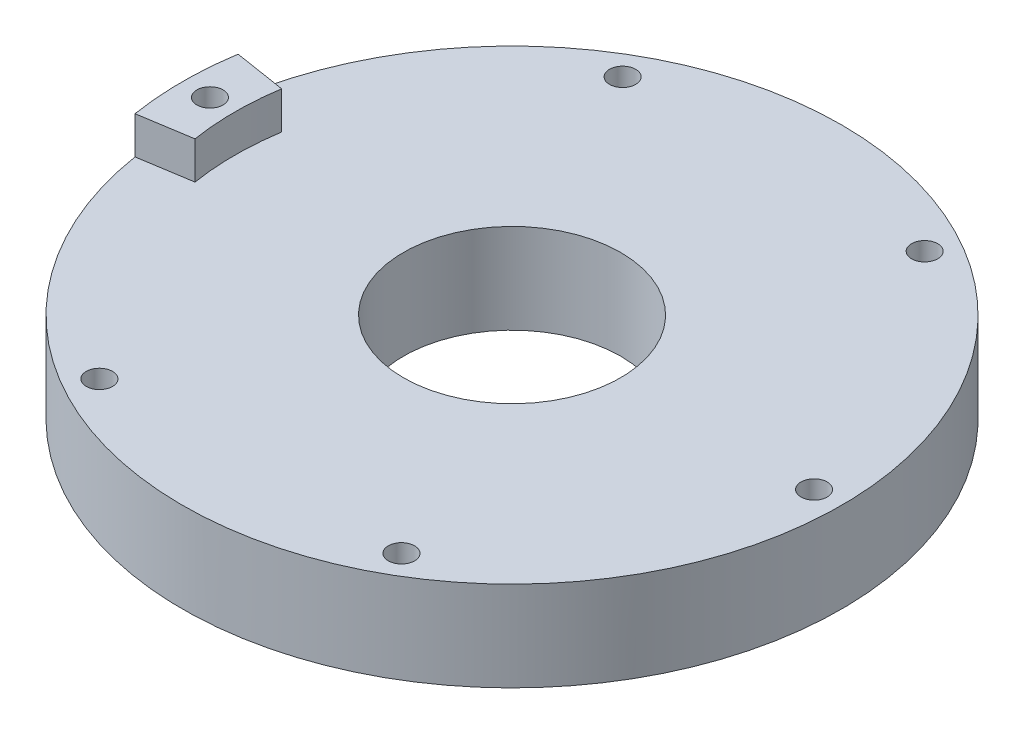
ISO-10303-21;
HEADER;
FILE_DESCRIPTION(('STEP AP214'),'2;1');
FILE_NAME('part.step','',(''),(''),'','','');
FILE_SCHEMA(('AUTOMOTIVE_DESIGN { 1 0 10303 214 1 1 1 1 }'));
ENDSEC;
DATA;
#1=APPLICATION_CONTEXT('core data for automotive mechanical design processes');
#2=APPLICATION_PROTOCOL_DEFINITION('international standard','automotive_design',2000,#1);
#3=PRODUCT_CONTEXT('',#1,'mechanical');
#4=PRODUCT('Part','Part','',(#3));
#5=PRODUCT_RELATED_PRODUCT_CATEGORY('part','',(#4));
#6=PRODUCT_DEFINITION_FORMATION('','',#4);
#7=PRODUCT_DEFINITION_CONTEXT('part definition',#1,'design');
#8=PRODUCT_DEFINITION('design','',#6,#7);
#9=PRODUCT_DEFINITION_SHAPE('','',#8);
#10=(LENGTH_UNIT() NAMED_UNIT(*) SI_UNIT(.MILLI.,.METRE.));
#11=(NAMED_UNIT(*) PLANE_ANGLE_UNIT() SI_UNIT($,.RADIAN.));
#12=(NAMED_UNIT(*) SI_UNIT($,.STERADIAN.) SOLID_ANGLE_UNIT());
#13=UNCERTAINTY_MEASURE_WITH_UNIT(LENGTH_MEASURE(1.E-05),#10,'distance_accuracy_value','');
#14=(GEOMETRIC_REPRESENTATION_CONTEXT(3) GLOBAL_UNCERTAINTY_ASSIGNED_CONTEXT((#13)) GLOBAL_UNIT_ASSIGNED_CONTEXT((#10,
#11,#12)) REPRESENTATION_CONTEXT('',''));
#15=CARTESIAN_POINT('',(0.,0.,0.));
#16=DIRECTION('',(0.,0.,1.));
#17=DIRECTION('',(1.,0.,0.));
#18=AXIS2_PLACEMENT_3D('',#15,#16,#17);
#19=CARTESIAN_POINT('',(0.,0.,0.));
#20=DIRECTION('',(0.,-1.,0.));
#21=DIRECTION('',(0.,0.,-1.));
#22=AXIS2_PLACEMENT_3D('',#19,#20,#21);
#23=CYLINDRICAL_SURFACE('',#22,44.);
#24=CARTESIAN_POINT('',(0.,12.,0.));
#25=DIRECTION('',(0.,-1.,0.));
#26=DIRECTION('',(0.,0.,-1.));
#27=AXIS2_PLACEMENT_3D('',#24,#25,#26);
#28=CIRCLE('',#27,44.);
#29=CARTESIAN_POINT('',(-43.4582869861861,12.,-6.88311646177017));
#30=VERTEX_POINT('',#29);
#31=CARTESIAN_POINT('',(-43.4582869861861,12.,6.88311646177018));
#32=VERTEX_POINT('',#31);
#33=EDGE_CURVE('E110',#30,#32,#28,.T.);
#34=ORIENTED_EDGE('',*,*,#33,.T.);
#35=DIRECTION('',(0.,-1.,0.));
#36=VECTOR('',#35,1.);
#37=CARTESIAN_POINT('',(-43.4582869861861,17.,6.88311646177018));
#38=LINE('',#37,#36);
#39=CARTESIAN_POINT('',(-43.4582869861861,17.,6.88311646177018));
#40=VERTEX_POINT('',#39);
#41=EDGE_CURVE('E50',#40,#32,#38,.T.);
#42=ORIENTED_EDGE('',*,*,#41,.F.);
#43=CARTESIAN_POINT('',(0.,17.,0.));
#44=DIRECTION('',(0.,1.,0.));
#45=DIRECTION('',(0.,0.,1.));
#46=AXIS2_PLACEMENT_3D('',#43,#44,#45);
#47=CIRCLE('',#46,44.);
#48=CARTESIAN_POINT('',(-43.4582869861861,17.,-6.88311646177017));
#49=VERTEX_POINT('',#48);
#50=EDGE_CURVE('E81',#49,#40,#47,.T.);
#51=ORIENTED_EDGE('',*,*,#50,.F.);
#52=DIRECTION('',(0.,-1.,0.));
#53=VECTOR('',#52,1.);
#54=CARTESIAN_POINT('',(-43.4582869861861,17.,-6.88311646177017));
#55=LINE('',#54,#53);
#56=EDGE_CURVE('E98',#49,#30,#55,.T.);
#57=ORIENTED_EDGE('',*,*,#56,.T.);
#58=EDGE_LOOP('',(#34,#42,#51,#57));
#59=FACE_BOUND('',#58,.T.);
#60=CARTESIAN_POINT('',(0.,0.,0.));
#61=DIRECTION('',(0.,-1.,0.));
#62=DIRECTION('',(0.,0.,-1.));
#63=AXIS2_PLACEMENT_3D('',#60,#61,#62);
#64=CIRCLE('',#63,44.);
#65=CARTESIAN_POINT('',(0.,0.,-44.));
#66=VERTEX_POINT('',#65);
#67=EDGE_CURVE('E11',#66,#66,#64,.T.);
#68=ORIENTED_EDGE('',*,*,#67,.F.);
#69=EDGE_LOOP('',(#68));
#70=FACE_BOUND('',#69,.T.);
#71=ADVANCED_FACE('F34',(#59,#70),#23,.T.);
#72=CARTESIAN_POINT('',(14.5,0.,0.));
#73=DIRECTION('',(0.,-1.,0.));
#74=DIRECTION('',(0.,0.,-1.));
#75=AXIS2_PLACEMENT_3D('',#72,#73,#74);
#76=PLANE('',#75);
#77=CARTESIAN_POINT('',(-20.1664317632625,0.,34.9292844213405));
#78=DIRECTION('',(0.,1.,0.));
#79=DIRECTION('',(0.866025403784433,0.,0.50000000000001));
#80=AXIS2_PLACEMENT_3D('',#77,#78,#79);
#81=CIRCLE('',#80,1.75);
#82=CARTESIAN_POINT('',(-18.6508873066397,0.,35.8042844213405));
#83=VERTEX_POINT('',#82);
#84=EDGE_CURVE('E145',#83,#83,#81,.T.);
#85=ORIENTED_EDGE('',*,*,#84,.T.);
#86=EDGE_LOOP('',(#85));
#87=FACE_BOUND('',#86,.T.);
#88=CARTESIAN_POINT('',(20.1664317632617,0.,34.9292844213409));
#89=DIRECTION('',(0.,1.,0.));
#90=DIRECTION('',(0.866025403784443,0.,-0.499999999999992));
#91=AXIS2_PLACEMENT_3D('',#88,#89,#90);
#92=CIRCLE('',#91,1.75);
#93=CARTESIAN_POINT('',(21.6819762198845,0.,34.0542844213409));
#94=VERTEX_POINT('',#93);
#95=EDGE_CURVE('E135',#94,#94,#92,.T.);
#96=ORIENTED_EDGE('',*,*,#95,.T.);
#97=EDGE_LOOP('',(#96));
#98=FACE_BOUND('',#97,.T.);
#99=CARTESIAN_POINT('',(40.3328635265242,0.,0.));
#100=DIRECTION('',(0.,1.,0.));
#101=DIRECTION('',(0.,0.,-1.));
#102=AXIS2_PLACEMENT_3D('',#99,#100,#101);
#103=CIRCLE('',#102,1.75);
#104=CARTESIAN_POINT('',(40.3328635265242,0.,-1.75));
#105=VERTEX_POINT('',#104);
#106=EDGE_CURVE('E132',#105,#105,#103,.T.);
#107=ORIENTED_EDGE('',*,*,#106,.T.);
#108=EDGE_LOOP('',(#107));
#109=FACE_BOUND('',#108,.T.);
#110=CARTESIAN_POINT('',(20.1664317632622,0.,-34.9292844213406));
#111=DIRECTION('',(0.,1.,0.));
#112=DIRECTION('',(-0.866025403784436,0.,-0.500000000000004));
#113=AXIS2_PLACEMENT_3D('',#110,#111,#112);
#114=CIRCLE('',#113,1.75);
#115=CARTESIAN_POINT('',(18.6508873066395,0.,-35.8042844213407));
#116=VERTEX_POINT('',#115);
#117=EDGE_CURVE('E129',#116,#116,#114,.T.);
#118=ORIENTED_EDGE('',*,*,#117,.T.);
#119=EDGE_LOOP('',(#118));
#120=FACE_BOUND('',#119,.T.);
#121=CARTESIAN_POINT('',(-20.166431763262,0.,-34.9292844213408));
#122=DIRECTION('',(0.,1.,0.));
#123=DIRECTION('',(-0.86602540378444,0.,0.499999999999998));
#124=AXIS2_PLACEMENT_3D('',#121,#122,#123);
#125=CIRCLE('',#124,1.75);
#126=CARTESIAN_POINT('',(-21.6819762198848,0.,-34.0542844213408));
#127=VERTEX_POINT('',#126);
#128=EDGE_CURVE('E125',#127,#127,#125,.T.);
#129=ORIENTED_EDGE('',*,*,#128,.T.);
#130=EDGE_LOOP('',(#129));
#131=FACE_BOUND('',#130,.T.);
#132=CARTESIAN_POINT('',(-40.3328635265242,0.,0.));
#133=DIRECTION('',(0.,1.,0.));
#134=DIRECTION('',(0.,0.,1.));
#135=AXIS2_PLACEMENT_3D('',#132,#133,#134);
#136=CIRCLE('',#135,1.75);
#137=CARTESIAN_POINT('',(-40.3328635265242,0.,1.75));
#138=VERTEX_POINT('',#137);
#139=EDGE_CURVE('E109',#138,#138,#136,.T.);
#140=ORIENTED_EDGE('',*,*,#139,.T.);
#141=EDGE_LOOP('',(#140));
#142=FACE_BOUND('',#141,.T.);
#143=ORIENTED_EDGE('',*,*,#67,.T.);
#144=EDGE_LOOP('',(#143));
#145=FACE_BOUND('',#144,.T.);
#146=CARTESIAN_POINT('',(0.,0.,0.));
#147=DIRECTION('',(0.,-1.,0.));
#148=DIRECTION('',(0.,0.,-1.));
#149=AXIS2_PLACEMENT_3D('',#146,#147,#148);
#150=CIRCLE('',#149,14.5);
#151=CARTESIAN_POINT('',(0.,0.,-14.5));
#152=VERTEX_POINT('',#151);
#153=EDGE_CURVE('E42',#152,#152,#150,.T.);
#154=ORIENTED_EDGE('',*,*,#153,.F.);
#155=EDGE_LOOP('',(#154));
#156=FACE_BOUND('',#155,.T.);
#157=ADVANCED_FACE('F171',(#87,#98,#109,#120,#131,#142,#145,#156),#76,.T.);
#158=CARTESIAN_POINT('',(0.,0.,0.));
#159=DIRECTION('',(0.,-1.,0.));
#160=DIRECTION('',(0.,0.,-1.));
#161=AXIS2_PLACEMENT_3D('',#158,#159,#160);
#162=CYLINDRICAL_SURFACE('',#161,14.5);
#163=ORIENTED_EDGE('',*,*,#153,.T.);
#164=EDGE_LOOP('',(#163));
#165=FACE_BOUND('',#164,.T.);
#166=CARTESIAN_POINT('',(0.,12.,0.));
#167=DIRECTION('',(0.,-1.,0.));
#168=DIRECTION('',(0.,0.,-1.));
#169=AXIS2_PLACEMENT_3D('',#166,#167,#168);
#170=CIRCLE('',#169,14.5);
#171=CARTESIAN_POINT('',(0.,12.,-14.5));
#172=VERTEX_POINT('',#171);
#173=EDGE_CURVE('E187',#172,#172,#170,.T.);
#174=ORIENTED_EDGE('',*,*,#173,.F.);
#175=EDGE_LOOP('',(#174));
#176=FACE_BOUND('',#175,.T.);
#177=ADVANCED_FACE('F176',(#165,#176),#162,.F.);
#178=CARTESIAN_POINT('',(14.5,12.,0.));
#179=DIRECTION('',(0.,1.,0.));
#180=DIRECTION('',(0.,0.,1.));
#181=AXIS2_PLACEMENT_3D('',#178,#179,#180);
#182=PLANE('',#181);
#183=CARTESIAN_POINT('',(-20.1664317632625,12.,34.9292844213405));
#184=DIRECTION('',(0.,1.,0.));
#185=DIRECTION('',(0.,0.,1.));
#186=AXIS2_PLACEMENT_3D('',#183,#184,#185);
#187=CIRCLE('',#186,1.75);
#188=CARTESIAN_POINT('',(-20.1664317632625,12.,36.6792844213405));
#189=VERTEX_POINT('',#188);
#190=EDGE_CURVE('E37',#189,#189,#187,.T.);
#191=ORIENTED_EDGE('',*,*,#190,.F.);
#192=EDGE_LOOP('',(#191));
#193=FACE_BOUND('',#192,.T.);
#194=CARTESIAN_POINT('',(20.1664317632617,12.,34.9292844213409));
#195=DIRECTION('',(0.,1.,0.));
#196=DIRECTION('',(0.,0.,1.));
#197=AXIS2_PLACEMENT_3D('',#194,#195,#196);
#198=CIRCLE('',#197,1.75);
#199=CARTESIAN_POINT('',(20.1664317632617,12.,36.6792844213409));
#200=VERTEX_POINT('',#199);
#201=EDGE_CURVE('E133',#200,#200,#198,.T.);
#202=ORIENTED_EDGE('',*,*,#201,.F.);
#203=EDGE_LOOP('',(#202));
#204=FACE_BOUND('',#203,.T.);
#205=CARTESIAN_POINT('',(40.3328635265242,12.,0.));
#206=DIRECTION('',(0.,1.,0.));
#207=DIRECTION('',(0.,0.,1.));
#208=AXIS2_PLACEMENT_3D('',#205,#206,#207);
#209=CIRCLE('',#208,1.75);
#210=CARTESIAN_POINT('',(40.3328635265242,12.,1.75));
#211=VERTEX_POINT('',#210);
#212=EDGE_CURVE('E130',#211,#211,#209,.T.);
#213=ORIENTED_EDGE('',*,*,#212,.F.);
#214=EDGE_LOOP('',(#213));
#215=FACE_BOUND('',#214,.T.);
#216=CARTESIAN_POINT('',(20.1664317632622,12.,-34.9292844213406));
#217=DIRECTION('',(0.,1.,0.));
#218=DIRECTION('',(0.,0.,1.));
#219=AXIS2_PLACEMENT_3D('',#216,#217,#218);
#220=CIRCLE('',#219,1.75);
#221=CARTESIAN_POINT('',(20.1664317632622,12.,-33.1792844213406));
#222=VERTEX_POINT('',#221);
#223=EDGE_CURVE('E126',#222,#222,#220,.T.);
#224=ORIENTED_EDGE('',*,*,#223,.F.);
#225=EDGE_LOOP('',(#224));
#226=FACE_BOUND('',#225,.T.);
#227=CARTESIAN_POINT('',(-20.166431763262,12.,-34.9292844213408));
#228=DIRECTION('',(0.,1.,0.));
#229=DIRECTION('',(0.,0.,1.));
#230=AXIS2_PLACEMENT_3D('',#227,#228,#229);
#231=CIRCLE('',#230,1.75);
#232=CARTESIAN_POINT('',(-20.166431763262,12.,-33.1792844213408));
#233=VERTEX_POINT('',#232);
#234=EDGE_CURVE('E121',#233,#233,#231,.T.);
#235=ORIENTED_EDGE('',*,*,#234,.F.);
#236=EDGE_LOOP('',(#235));
#237=FACE_BOUND('',#236,.T.);
#238=DIRECTION('',(-0.987688340595138,0.,-0.156434465040231));
#239=VECTOR('',#238,1.);
#240=CARTESIAN_POINT('',(0.,12.,0.));
#241=LINE('',#240,#239);
#242=CARTESIAN_POINT('',(-36.5444686020201,12.,-5.78807520648855));
#243=VERTEX_POINT('',#242);
#244=EDGE_CURVE('E76',#243,#30,#241,.T.);
#245=ORIENTED_EDGE('',*,*,#244,.F.);
#246=CARTESIAN_POINT('',(0.,12.,0.));
#247=DIRECTION('',(0.,1.,0.));
#248=DIRECTION('',(0.,0.,1.));
#249=AXIS2_PLACEMENT_3D('',#246,#247,#248);
#250=CIRCLE('',#249,37.);
#251=CARTESIAN_POINT('',(-36.5444686020201,12.,5.78807520648856));
#252=VERTEX_POINT('',#251);
#253=EDGE_CURVE('E104',#243,#252,#250,.T.);
#254=ORIENTED_EDGE('',*,*,#253,.T.);
#255=DIRECTION('',(-0.987688340595138,0.,0.156434465040231));
#256=VECTOR('',#255,1.);
#257=CARTESIAN_POINT('',(0.,12.,0.));
#258=LINE('',#257,#256);
#259=EDGE_CURVE('E86',#252,#32,#258,.T.);
#260=ORIENTED_EDGE('',*,*,#259,.T.);
#261=ORIENTED_EDGE('',*,*,#33,.F.);
#262=EDGE_LOOP('',(#245,#254,#260,#261));
#263=FACE_BOUND('',#262,.T.);
#264=ORIENTED_EDGE('',*,*,#173,.T.);
#265=EDGE_LOOP('',(#264));
#266=FACE_BOUND('',#265,.T.);
#267=ADVANCED_FACE('F193',(#193,#204,#215,#226,#237,#263,#266),#182,.T.);
#268=CARTESIAN_POINT('',(0.,17.,0.));
#269=DIRECTION('',(0.156434465040231,0.,0.987688340595138));
#270=DIRECTION('',(0.987688340595138,0.,-0.156434465040231));
#271=AXIS2_PLACEMENT_3D('',#268,#269,#270);
#272=PLANE('',#271);
#273=ORIENTED_EDGE('',*,*,#259,.F.);
#274=DIRECTION('',(0.,-1.,0.));
#275=VECTOR('',#274,1.);
#276=CARTESIAN_POINT('',(-36.5444686020201,17.,5.78807520648856));
#277=LINE('',#276,#275);
#278=CARTESIAN_POINT('',(-36.5444686020201,17.,5.78807520648856));
#279=VERTEX_POINT('',#278);
#280=EDGE_CURVE('E83',#279,#252,#277,.T.);
#281=ORIENTED_EDGE('',*,*,#280,.F.);
#282=DIRECTION('',(-0.987688340595138,0.,0.156434465040231));
#283=VECTOR('',#282,1.);
#284=CARTESIAN_POINT('',(0.,17.,0.));
#285=LINE('',#284,#283);
#286=EDGE_CURVE('E85',#279,#40,#285,.T.);
#287=ORIENTED_EDGE('',*,*,#286,.T.);
#288=ORIENTED_EDGE('',*,*,#41,.T.);
#289=EDGE_LOOP('',(#273,#281,#287,#288));
#290=FACE_BOUND('',#289,.T.);
#291=ADVANCED_FACE('F84',(#290),#272,.T.);
#292=CARTESIAN_POINT('',(0.,17.,0.));
#293=DIRECTION('',(0.,-1.,0.));
#294=DIRECTION('',(0.,0.,-1.));
#295=AXIS2_PLACEMENT_3D('',#292,#293,#294);
#296=CYLINDRICAL_SURFACE('',#295,37.);
#297=ORIENTED_EDGE('',*,*,#253,.F.);
#298=DIRECTION('',(0.,-1.,0.));
#299=VECTOR('',#298,1.);
#300=CARTESIAN_POINT('',(-36.5444686020201,17.,-5.78807520648855));
#301=LINE('',#300,#299);
#302=CARTESIAN_POINT('',(-36.5444686020201,17.,-5.78807520648855));
#303=VERTEX_POINT('',#302);
#304=EDGE_CURVE('E91',#303,#243,#301,.T.);
#305=ORIENTED_EDGE('',*,*,#304,.F.);
#306=CARTESIAN_POINT('',(0.,17.,0.));
#307=DIRECTION('',(0.,1.,0.));
#308=DIRECTION('',(0.,0.,1.));
#309=AXIS2_PLACEMENT_3D('',#306,#307,#308);
#310=CIRCLE('',#309,37.);
#311=EDGE_CURVE('E94',#303,#279,#310,.T.);
#312=ORIENTED_EDGE('',*,*,#311,.T.);
#313=ORIENTED_EDGE('',*,*,#280,.T.);
#314=EDGE_LOOP('',(#297,#305,#312,#313));
#315=FACE_BOUND('',#314,.T.);
#316=ADVANCED_FACE('F96',(#315),#296,.F.);
#317=CARTESIAN_POINT('',(0.,17.,0.));
#318=DIRECTION('',(-0.156434465040231,0.,0.987688340595138));
#319=DIRECTION('',(0.987688340595138,0.,0.156434465040231));
#320=AXIS2_PLACEMENT_3D('',#317,#318,#319);
#321=PLANE('',#320);
#322=ORIENTED_EDGE('',*,*,#244,.T.);
#323=ORIENTED_EDGE('',*,*,#56,.F.);
#324=DIRECTION('',(-0.987688340595138,0.,-0.156434465040231));
#325=VECTOR('',#324,1.);
#326=CARTESIAN_POINT('',(0.,17.,0.));
#327=LINE('',#326,#325);
#328=EDGE_CURVE('E59',#303,#49,#327,.T.);
#329=ORIENTED_EDGE('',*,*,#328,.F.);
#330=ORIENTED_EDGE('',*,*,#304,.T.);
#331=EDGE_LOOP('',(#322,#323,#329,#330));
#332=FACE_BOUND('',#331,.T.);
#333=ADVANCED_FACE('F160',(#332),#321,.F.);
#334=CARTESIAN_POINT('',(0.,17.,0.));
#335=DIRECTION('',(0.,1.,0.));
#336=DIRECTION('',(0.,0.,1.));
#337=AXIS2_PLACEMENT_3D('',#334,#335,#336);
#338=PLANE('',#337);
#339=CARTESIAN_POINT('',(-40.3328635265242,17.,0.));
#340=DIRECTION('',(0.,1.,0.));
#341=DIRECTION('',(0.,0.,1.));
#342=AXIS2_PLACEMENT_3D('',#339,#340,#341);
#343=CIRCLE('',#342,1.75);
#344=CARTESIAN_POINT('',(-40.3328635265242,17.,1.75));
#345=VERTEX_POINT('',#344);
#346=EDGE_CURVE('E124',#345,#345,#343,.T.);
#347=ORIENTED_EDGE('',*,*,#346,.F.);
#348=EDGE_LOOP('',(#347));
#349=FACE_BOUND('',#348,.T.);
#350=ORIENTED_EDGE('',*,*,#50,.T.);
#351=ORIENTED_EDGE('',*,*,#286,.F.);
#352=ORIENTED_EDGE('',*,*,#311,.F.);
#353=ORIENTED_EDGE('',*,*,#328,.T.);
#354=EDGE_LOOP('',(#350,#351,#352,#353));
#355=FACE_BOUND('',#354,.T.);
#356=ADVANCED_FACE('F93',(#349,#355),#338,.T.);
#357=CARTESIAN_POINT('',(-40.3328635265242,0.,0.));
#358=DIRECTION('',(0.,1.,0.));
#359=DIRECTION('',(0.,0.,1.));
#360=AXIS2_PLACEMENT_3D('',#357,#358,#359);
#361=CYLINDRICAL_SURFACE('',#360,1.75);
#362=ORIENTED_EDGE('',*,*,#139,.F.);
#363=EDGE_LOOP('',(#362));
#364=FACE_BOUND('',#363,.T.);
#365=ORIENTED_EDGE('',*,*,#346,.T.);
#366=EDGE_LOOP('',(#365));
#367=FACE_BOUND('',#366,.T.);
#368=ADVANCED_FACE('F157',(#364,#367),#361,.F.);
#369=CARTESIAN_POINT('',(-20.166431763262,0.,-34.9292844213408));
#370=DIRECTION('',(0.,1.,0.));
#371=DIRECTION('',(0.,0.,1.));
#372=AXIS2_PLACEMENT_3D('',#369,#370,#371);
#373=CYLINDRICAL_SURFACE('',#372,1.75);
#374=ORIENTED_EDGE('',*,*,#234,.T.);
#375=EDGE_LOOP('',(#374));
#376=FACE_BOUND('',#375,.T.);
#377=ORIENTED_EDGE('',*,*,#128,.F.);
#378=EDGE_LOOP('',(#377));
#379=FACE_BOUND('',#378,.T.);
#380=ADVANCED_FACE('F166',(#376,#379),#373,.F.);
#381=CARTESIAN_POINT('',(20.1664317632622,0.,-34.9292844213406));
#382=DIRECTION('',(0.,1.,0.));
#383=DIRECTION('',(0.,0.,1.));
#384=AXIS2_PLACEMENT_3D('',#381,#382,#383);
#385=CYLINDRICAL_SURFACE('',#384,1.75);
#386=ORIENTED_EDGE('',*,*,#223,.T.);
#387=EDGE_LOOP('',(#386));
#388=FACE_BOUND('',#387,.T.);
#389=ORIENTED_EDGE('',*,*,#117,.F.);
#390=EDGE_LOOP('',(#389));
#391=FACE_BOUND('',#390,.T.);
#392=ADVANCED_FACE('F251',(#388,#391),#385,.F.);
#393=CARTESIAN_POINT('',(40.3328635265242,0.,0.));
#394=DIRECTION('',(0.,1.,0.));
#395=DIRECTION('',(0.,0.,1.));
#396=AXIS2_PLACEMENT_3D('',#393,#394,#395);
#397=CYLINDRICAL_SURFACE('',#396,1.75);
#398=ORIENTED_EDGE('',*,*,#212,.T.);
#399=EDGE_LOOP('',(#398));
#400=FACE_BOUND('',#399,.T.);
#401=ORIENTED_EDGE('',*,*,#106,.F.);
#402=EDGE_LOOP('',(#401));
#403=FACE_BOUND('',#402,.T.);
#404=ADVANCED_FACE('F261',(#400,#403),#397,.F.);
#405=CARTESIAN_POINT('',(20.1664317632617,0.,34.9292844213409));
#406=DIRECTION('',(0.,1.,0.));
#407=DIRECTION('',(0.,0.,1.));
#408=AXIS2_PLACEMENT_3D('',#405,#406,#407);
#409=CYLINDRICAL_SURFACE('',#408,1.75);
#410=ORIENTED_EDGE('',*,*,#201,.T.);
#411=EDGE_LOOP('',(#410));
#412=FACE_BOUND('',#411,.T.);
#413=ORIENTED_EDGE('',*,*,#95,.F.);
#414=EDGE_LOOP('',(#413));
#415=FACE_BOUND('',#414,.T.);
#416=ADVANCED_FACE('F271',(#412,#415),#409,.F.);
#417=CARTESIAN_POINT('',(-20.1664317632625,0.,34.9292844213405));
#418=DIRECTION('',(0.,1.,0.));
#419=DIRECTION('',(0.,0.,1.));
#420=AXIS2_PLACEMENT_3D('',#417,#418,#419);
#421=CYLINDRICAL_SURFACE('',#420,1.75);
#422=ORIENTED_EDGE('',*,*,#190,.T.);
#423=EDGE_LOOP('',(#422));
#424=FACE_BOUND('',#423,.T.);
#425=ORIENTED_EDGE('',*,*,#84,.F.);
#426=EDGE_LOOP('',(#425));
#427=FACE_BOUND('',#426,.T.);
#428=ADVANCED_FACE('F281',(#424,#427),#421,.F.);
#429=CLOSED_SHELL('',(#71,#157,#177,#267,#291,#316,#333,#356,#368,#380,#392,#404,#416,#428));
#430=MANIFOLD_SOLID_BREP('B2',#429);
#431=ADVANCED_BREP_SHAPE_REPRESENTATION('',(#18,#430),#14);
#432=SHAPE_DEFINITION_REPRESENTATION(#9,#431);
ENDSEC;
END-ISO-10303-21;
